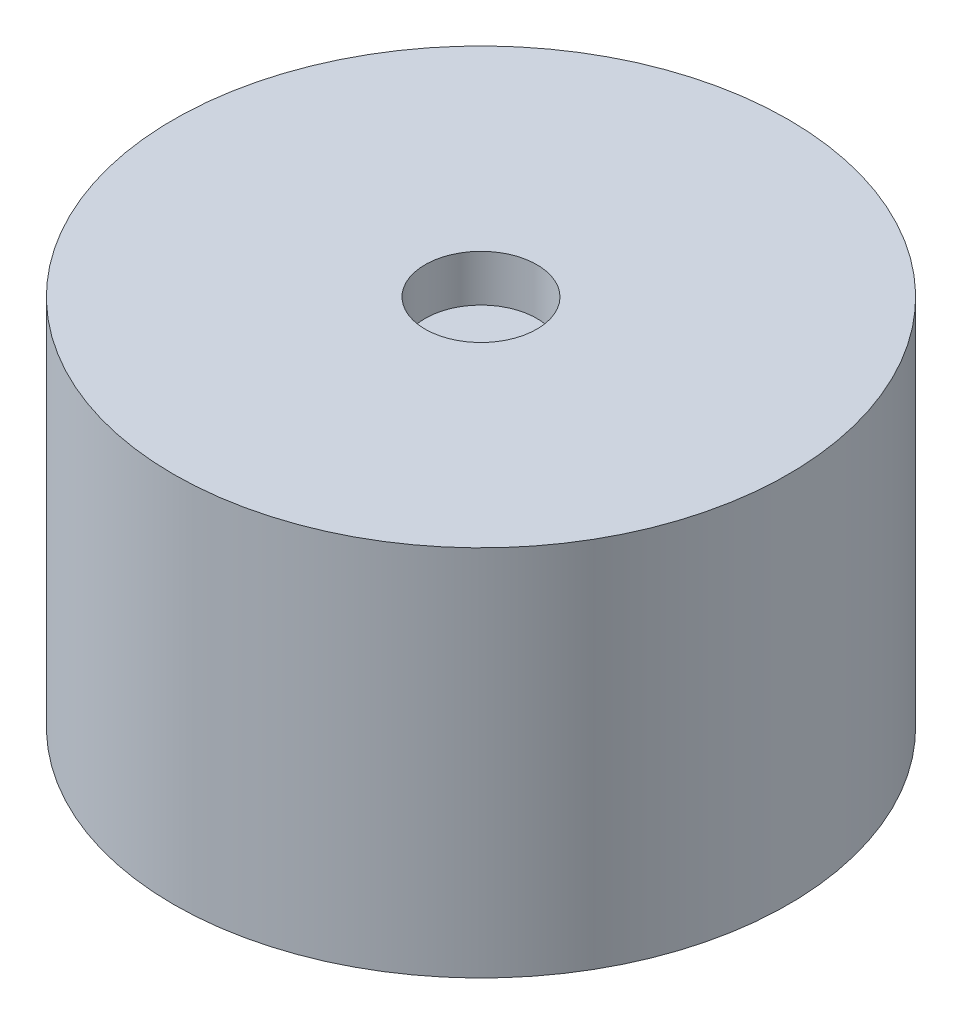
ISO-10303-21;
HEADER;
FILE_DESCRIPTION(('STEP AP214'),'2;1');
FILE_NAME('part.step','',(''),(''),'','','');
FILE_SCHEMA(('AUTOMOTIVE_DESIGN { 1 0 10303 214 1 1 1 1 }'));
ENDSEC;
DATA;
#1=APPLICATION_CONTEXT('core data for automotive mechanical design processes');
#2=APPLICATION_PROTOCOL_DEFINITION('international standard','automotive_design',2000,#1);
#3=PRODUCT_CONTEXT('',#1,'mechanical');
#4=PRODUCT('Part','Part','',(#3));
#5=PRODUCT_RELATED_PRODUCT_CATEGORY('part','',(#4));
#6=PRODUCT_DEFINITION_FORMATION('','',#4);
#7=PRODUCT_DEFINITION_CONTEXT('part definition',#1,'design');
#8=PRODUCT_DEFINITION('design','',#6,#7);
#9=PRODUCT_DEFINITION_SHAPE('','',#8);
#10=(LENGTH_UNIT() NAMED_UNIT(*) SI_UNIT(.MILLI.,.METRE.));
#11=(NAMED_UNIT(*) PLANE_ANGLE_UNIT() SI_UNIT($,.RADIAN.));
#12=(NAMED_UNIT(*) SI_UNIT($,.STERADIAN.) SOLID_ANGLE_UNIT());
#13=UNCERTAINTY_MEASURE_WITH_UNIT(LENGTH_MEASURE(1.E-05),#10,'distance_accuracy_value','');
#14=(GEOMETRIC_REPRESENTATION_CONTEXT(3) GLOBAL_UNCERTAINTY_ASSIGNED_CONTEXT((#13)) GLOBAL_UNIT_ASSIGNED_CONTEXT((#10,
#11,#12)) REPRESENTATION_CONTEXT('',''));
#15=CARTESIAN_POINT('',(0.,0.,0.));
#16=DIRECTION('',(0.,0.,1.));
#17=DIRECTION('',(1.,0.,0.));
#18=AXIS2_PLACEMENT_3D('',#15,#16,#17);
#19=CARTESIAN_POINT('',(0.,40.,0.));
#20=DIRECTION('',(0.,-1.,0.));
#21=DIRECTION('',(0.,0.,-1.));
#22=AXIS2_PLACEMENT_3D('',#19,#20,#21);
#23=CYLINDRICAL_SURFACE('',#22,33.);
#24=CARTESIAN_POINT('',(0.,40.,0.));
#25=DIRECTION('',(0.,1.,0.));
#26=DIRECTION('',(0.,0.,1.));
#27=AXIS2_PLACEMENT_3D('',#24,#25,#26);
#28=CIRCLE('',#27,33.);
#29=CARTESIAN_POINT('',(0.,40.,33.));
#30=VERTEX_POINT('',#29);
#31=EDGE_CURVE('E10',#30,#30,#28,.T.);
#32=ORIENTED_EDGE('',*,*,#31,.F.);
#33=EDGE_LOOP('',(#32));
#34=FACE_BOUND('',#33,.T.);
#35=CARTESIAN_POINT('',(0.,0.,0.));
#36=DIRECTION('',(0.,1.,0.));
#37=DIRECTION('',(0.,0.,1.));
#38=AXIS2_PLACEMENT_3D('',#35,#36,#37);
#39=CIRCLE('',#38,33.);
#40=CARTESIAN_POINT('',(0.,0.,33.));
#41=VERTEX_POINT('',#40);
#42=EDGE_CURVE('E36',#41,#41,#39,.T.);
#43=ORIENTED_EDGE('',*,*,#42,.T.);
#44=EDGE_LOOP('',(#43));
#45=FACE_BOUND('',#44,.T.);
#46=ADVANCED_FACE('F33',(#34,#45),#23,.T.);
#47=CARTESIAN_POINT('',(0.,40.,0.));
#48=DIRECTION('',(0.,1.,0.));
#49=DIRECTION('',(0.,0.,1.));
#50=AXIS2_PLACEMENT_3D('',#47,#48,#49);
#51=PLANE('',#50);
#52=CARTESIAN_POINT('',(0.,40.,0.));
#53=DIRECTION('',(0.,1.,0.));
#54=DIRECTION('',(0.,0.,1.));
#55=AXIS2_PLACEMENT_3D('',#52,#53,#54);
#56=CIRCLE('',#55,6.);
#57=CARTESIAN_POINT('',(0.,40.,6.));
#58=VERTEX_POINT('',#57);
#59=EDGE_CURVE('E45',#58,#58,#56,.T.);
#60=ORIENTED_EDGE('',*,*,#59,.F.);
#61=EDGE_LOOP('',(#60));
#62=FACE_BOUND('',#61,.T.);
#63=ORIENTED_EDGE('',*,*,#31,.T.);
#64=EDGE_LOOP('',(#63));
#65=FACE_BOUND('',#64,.T.);
#66=ADVANCED_FACE('F60',(#62,#65),#51,.T.);
#67=CARTESIAN_POINT('',(0.,0.,0.));
#68=DIRECTION('',(0.,1.,0.));
#69=DIRECTION('',(0.,0.,1.));
#70=AXIS2_PLACEMENT_3D('',#67,#68,#69);
#71=PLANE('',#70);
#72=ORIENTED_EDGE('',*,*,#42,.F.);
#73=EDGE_LOOP('',(#72));
#74=FACE_BOUND('',#73,.T.);
#75=ADVANCED_FACE('F56',(#74),#71,.F.);
#76=CARTESIAN_POINT('',(0.,35.,0.));
#77=DIRECTION('',(0.,1.,0.));
#78=DIRECTION('',(0.,0.,1.));
#79=AXIS2_PLACEMENT_3D('',#76,#77,#78);
#80=CYLINDRICAL_SURFACE('',#79,6.);
#81=CARTESIAN_POINT('',(0.,35.,0.));
#82=DIRECTION('',(0.,1.,0.));
#83=DIRECTION('',(0.,0.,1.));
#84=AXIS2_PLACEMENT_3D('',#81,#82,#83);
#85=CIRCLE('',#84,6.);
#86=CARTESIAN_POINT('',(0.,35.,6.));
#87=VERTEX_POINT('',#86);
#88=EDGE_CURVE('E43',#87,#87,#85,.T.);
#89=ORIENTED_EDGE('',*,*,#88,.F.);
#90=EDGE_LOOP('',(#89));
#91=FACE_BOUND('',#90,.T.);
#92=ORIENTED_EDGE('',*,*,#59,.T.);
#93=EDGE_LOOP('',(#92));
#94=FACE_BOUND('',#93,.T.);
#95=ADVANCED_FACE('F53',(#91,#94),#80,.F.);
#96=CARTESIAN_POINT('',(0.,35.,0.));
#97=DIRECTION('',(0.,1.,0.));
#98=DIRECTION('',(0.,0.,1.));
#99=AXIS2_PLACEMENT_3D('',#96,#97,#98);
#100=PLANE('',#99);
#101=ORIENTED_EDGE('',*,*,#88,.T.);
#102=EDGE_LOOP('',(#101));
#103=FACE_BOUND('',#102,.T.);
#104=ADVANCED_FACE('F51',(#103),#100,.T.);
#105=CLOSED_SHELL('',(#46,#66,#75,#95,#104));
#106=MANIFOLD_SOLID_BREP('B2',#105);
#107=ADVANCED_BREP_SHAPE_REPRESENTATION('',(#18,#106),#14);
#108=SHAPE_DEFINITION_REPRESENTATION(#9,#107);
ENDSEC;
END-ISO-10303-21;
